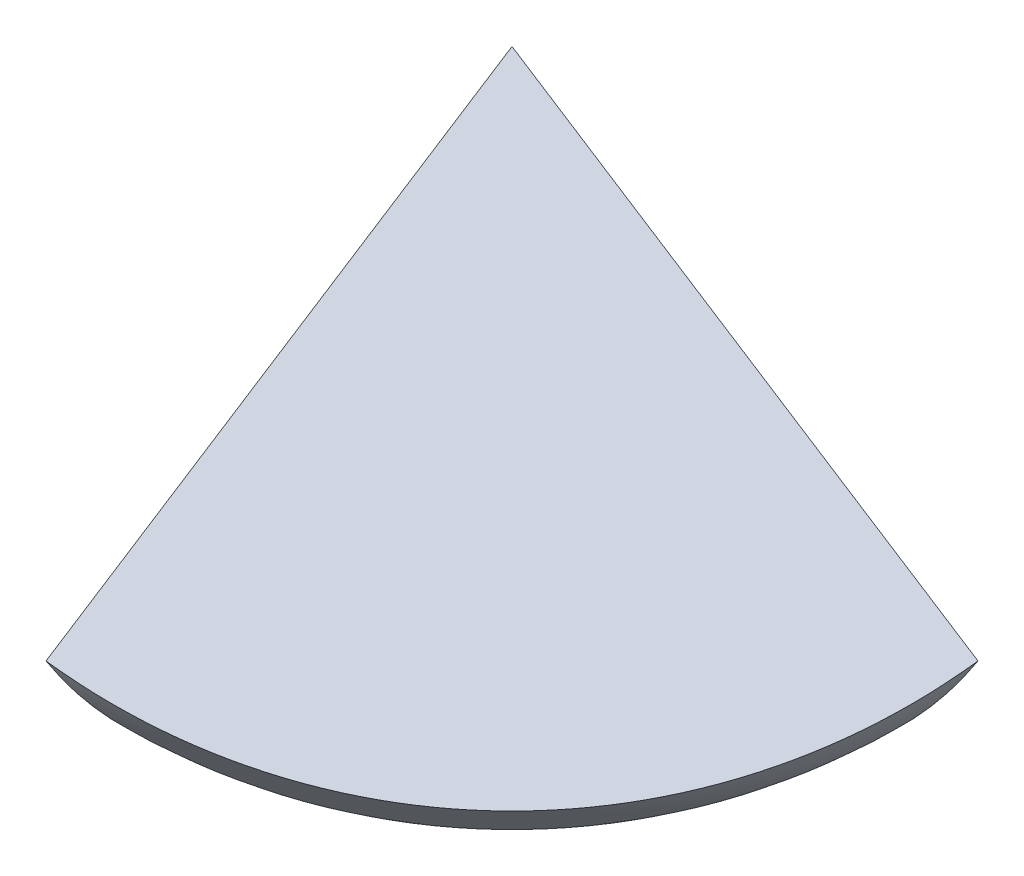
ISO-10303-21;
HEADER;
FILE_DESCRIPTION(('STEP AP214'),'2;1');
FILE_NAME('part.step','',(''),(''),'','','');
FILE_SCHEMA(('AUTOMOTIVE_DESIGN { 1 0 10303 214 1 1 1 1 }'));
ENDSEC;
DATA;
#1=APPLICATION_CONTEXT('core data for automotive mechanical design processes');
#2=APPLICATION_PROTOCOL_DEFINITION('international standard','automotive_design',2000,#1);
#3=PRODUCT_CONTEXT('',#1,'mechanical');
#4=PRODUCT('Part','Part','',(#3));
#5=PRODUCT_RELATED_PRODUCT_CATEGORY('part','',(#4));
#6=PRODUCT_DEFINITION_FORMATION('','',#4);
#7=PRODUCT_DEFINITION_CONTEXT('part definition',#1,'design');
#8=PRODUCT_DEFINITION('design','',#6,#7);
#9=PRODUCT_DEFINITION_SHAPE('','',#8);
#10=(LENGTH_UNIT() NAMED_UNIT(*) SI_UNIT(.MILLI.,.METRE.));
#11=(NAMED_UNIT(*) PLANE_ANGLE_UNIT() SI_UNIT($,.RADIAN.));
#12=(NAMED_UNIT(*) SI_UNIT($,.STERADIAN.) SOLID_ANGLE_UNIT());
#13=UNCERTAINTY_MEASURE_WITH_UNIT(LENGTH_MEASURE(1.E-05),#10,'distance_accuracy_value','');
#14=(GEOMETRIC_REPRESENTATION_CONTEXT(3) GLOBAL_UNCERTAINTY_ASSIGNED_CONTEXT((#13)) GLOBAL_UNIT_ASSIGNED_CONTEXT((#10,
#11,#12)) REPRESENTATION_CONTEXT('',''));
#15=CARTESIAN_POINT('',(0.,0.,0.));
#16=DIRECTION('',(0.,0.,1.));
#17=DIRECTION('',(1.,0.,0.));
#18=AXIS2_PLACEMENT_3D('',#15,#16,#17);
#19=CARTESIAN_POINT('',(0.,0.,0.));
#20=DIRECTION('',(0.,1.,0.));
#21=DIRECTION('',(0.,0.,1.));
#22=AXIS2_PLACEMENT_3D('',#19,#20,#21);
#23=SPHERICAL_SURFACE('',#22,150.);
#24=CARTESIAN_POINT('',(0.,0.,0.));
#25=DIRECTION('',(-0.475312608925514,-0.740375477438875,-0.475312608925514));
#26=DIRECTION('',(0.,-0.540240320477653,0.841510781945307));
#27=AXIS2_PLACEMENT_3D('',#24,#25,#26);
#28=CIRCLE('',#27,150.);
#29=CARTESIAN_POINT('',(126.226617291796,-81.0360480716481,0.));
#30=VERTEX_POINT('',#29);
#31=CARTESIAN_POINT('',(0.,-81.036048071648,126.226617291796));
#32=VERTEX_POINT('',#31);
#33=EDGE_CURVE('E57',#30,#32,#28,.T.);
#34=ORIENTED_EDGE('',*,*,#33,.T.);
#35=CARTESIAN_POINT('',(0.,0.,0.));
#36=DIRECTION('',(-1.,0.,0.));
#37=DIRECTION('',(0.,0.,1.));
#38=AXIS2_PLACEMENT_3D('',#35,#36,#37);
#39=CIRCLE('',#38,150.);
#40=CARTESIAN_POINT('',(0.,-150.,0.));
#41=VERTEX_POINT('',#40);
#42=EDGE_CURVE('E11',#41,#32,#39,.T.);
#43=ORIENTED_EDGE('',*,*,#42,.F.);
#44=CARTESIAN_POINT('',(0.,0.,0.));
#45=DIRECTION('',(0.,0.,1.));
#46=DIRECTION('',(1.,0.,0.));
#47=AXIS2_PLACEMENT_3D('',#44,#45,#46);
#48=CIRCLE('',#47,150.);
#49=EDGE_CURVE('E49',#41,#30,#48,.T.);
#50=ORIENTED_EDGE('',*,*,#49,.T.);
#51=EDGE_LOOP('',(#34,#43,#50));
#52=FACE_BOUND('',#51,.T.);
#53=ADVANCED_FACE('F35',(#52),#23,.T.);
#54=CARTESIAN_POINT('',(0.,0.,0.));
#55=DIRECTION('',(-1.,0.,0.));
#56=DIRECTION('',(0.,0.,1.));
#57=AXIS2_PLACEMENT_3D('',#54,#55,#56);
#58=PLANE('',#57);
#59=DIRECTION('',(0.,0.540240320477653,-0.841510781945307));
#60=VECTOR('',#59,1.);
#61=CARTESIAN_POINT('',(0.,0.,0.));
#62=LINE('',#61,#60);
#63=CARTESIAN_POINT('',(0.,0.,0.));
#64=VERTEX_POINT('',#63);
#65=EDGE_CURVE('E62',#32,#64,#62,.T.);
#66=ORIENTED_EDGE('',*,*,#65,.T.);
#67=DIRECTION('',(0.,-1.,0.));
#68=VECTOR('',#67,1.);
#69=CARTESIAN_POINT('',(0.,0.,0.));
#70=LINE('',#69,#68);
#71=EDGE_CURVE('E42',#64,#41,#70,.T.);
#72=ORIENTED_EDGE('',*,*,#71,.T.);
#73=ORIENTED_EDGE('',*,*,#42,.T.);
#74=EDGE_LOOP('',(#66,#72,#73));
#75=FACE_BOUND('',#74,.T.);
#76=ADVANCED_FACE('F70',(#75),#58,.T.);
#77=CARTESIAN_POINT('',(0.,0.,0.));
#78=DIRECTION('',(0.,0.,1.));
#79=DIRECTION('',(1.,0.,0.));
#80=AXIS2_PLACEMENT_3D('',#77,#78,#79);
#81=PLANE('',#80);
#82=DIRECTION('',(-0.841510781945307,0.540240320477653,0.));
#83=VECTOR('',#82,1.);
#84=CARTESIAN_POINT('',(0.,0.,0.));
#85=LINE('',#84,#83);
#86=EDGE_CURVE('E64',#30,#64,#85,.T.);
#87=ORIENTED_EDGE('',*,*,#86,.F.);
#88=ORIENTED_EDGE('',*,*,#49,.F.);
#89=ORIENTED_EDGE('',*,*,#71,.F.);
#90=EDGE_LOOP('',(#87,#88,#89));
#91=FACE_BOUND('',#90,.T.);
#92=ADVANCED_FACE('F73',(#91),#81,.F.);
#93=CARTESIAN_POINT('',(0.,0.,0.));
#94=DIRECTION('',(0.475312608925514,0.740375477438875,0.475312608925514));
#95=DIRECTION('',(0.,-0.540240320477653,0.841510781945307));
#96=AXIS2_PLACEMENT_3D('',#93,#94,#95);
#97=PLANE('',#96);
#98=ORIENTED_EDGE('',*,*,#86,.T.);
#99=ORIENTED_EDGE('',*,*,#65,.F.);
#100=ORIENTED_EDGE('',*,*,#33,.F.);
#101=EDGE_LOOP('',(#98,#99,#100));
#102=FACE_BOUND('',#101,.T.);
#103=ADVANCED_FACE('F63',(#102),#97,.T.);
#104=CLOSED_SHELL('',(#53,#76,#92,#103));
#105=MANIFOLD_SOLID_BREP('B2',#104);
#106=ADVANCED_BREP_SHAPE_REPRESENTATION('',(#18,#105),#14);
#107=SHAPE_DEFINITION_REPRESENTATION(#9,#106);
ENDSEC;
END-ISO-10303-21;
